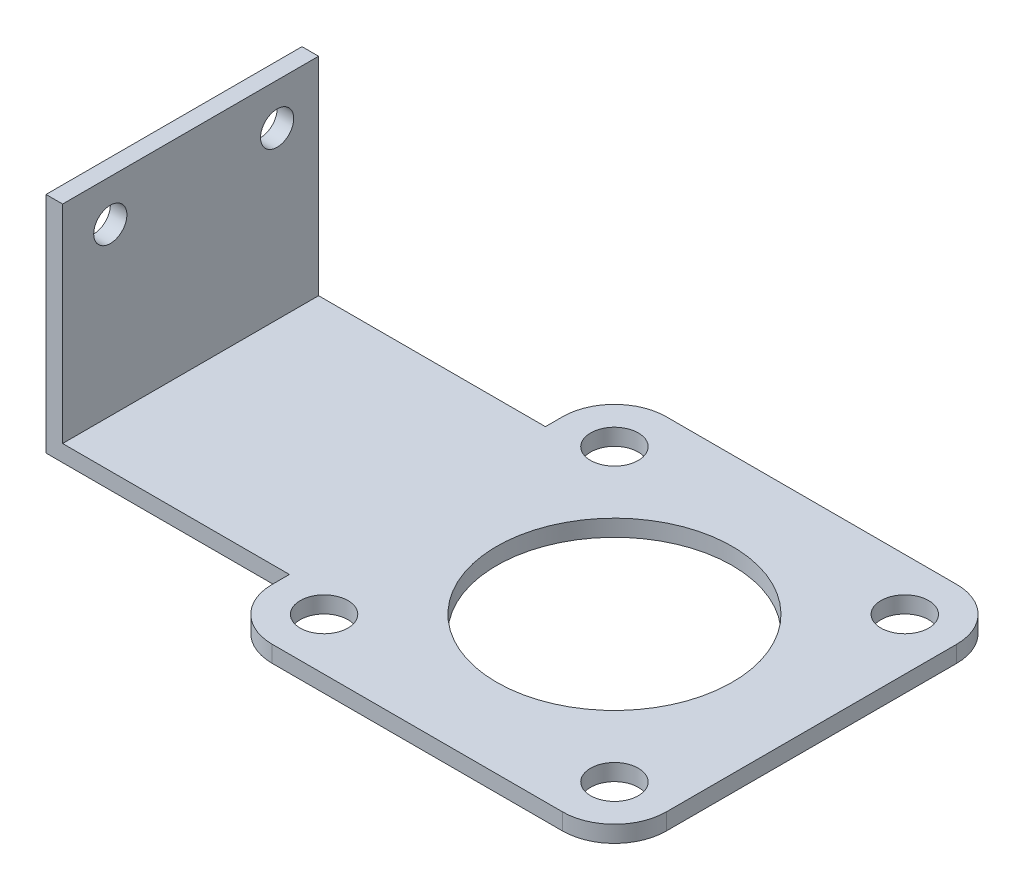
ISO-10303-21;
HEADER;
FILE_DESCRIPTION(('STEP AP214'),'2;1');
FILE_NAME('part.step','',(''),(''),'','','');
FILE_SCHEMA(('AUTOMOTIVE_DESIGN { 1 0 10303 214 1 1 1 1 }'));
ENDSEC;
DATA;
#1=APPLICATION_CONTEXT('core data for automotive mechanical design processes');
#2=APPLICATION_PROTOCOL_DEFINITION('international standard','automotive_design',2000,#1);
#3=PRODUCT_CONTEXT('',#1,'mechanical');
#4=PRODUCT('Part','Part','',(#3));
#5=PRODUCT_RELATED_PRODUCT_CATEGORY('part','',(#4));
#6=PRODUCT_DEFINITION_FORMATION('','',#4);
#7=PRODUCT_DEFINITION_CONTEXT('part definition',#1,'design');
#8=PRODUCT_DEFINITION('design','',#6,#7);
#9=PRODUCT_DEFINITION_SHAPE('','',#8);
#10=(LENGTH_UNIT() NAMED_UNIT(*) SI_UNIT(.MILLI.,.METRE.));
#11=(NAMED_UNIT(*) PLANE_ANGLE_UNIT() SI_UNIT($,.RADIAN.));
#12=(NAMED_UNIT(*) SI_UNIT($,.STERADIAN.) SOLID_ANGLE_UNIT());
#13=UNCERTAINTY_MEASURE_WITH_UNIT(LENGTH_MEASURE(1.E-05),#10,'distance_accuracy_value','');
#14=(GEOMETRIC_REPRESENTATION_CONTEXT(3) GLOBAL_UNCERTAINTY_ASSIGNED_CONTEXT((#13)) GLOBAL_UNIT_ASSIGNED_CONTEXT((#10,
#11,#12)) REPRESENTATION_CONTEXT('',''));
#15=CARTESIAN_POINT('',(0.,0.,0.));
#16=DIRECTION('',(0.,0.,1.));
#17=DIRECTION('',(1.,0.,0.));
#18=AXIS2_PLACEMENT_3D('',#15,#16,#17);
#19=CARTESIAN_POINT('',(82.5,4.,-82.5));
#20=DIRECTION('',(0.,-1.,0.));
#21=DIRECTION('',(0.,0.,-1.));
#22=AXIS2_PLACEMENT_3D('',#19,#20,#21);
#23=PLANE('',#22);
#24=CARTESIAN_POINT('',(47.5,4.,-47.5));
#25=DIRECTION('',(0.,1.,0.));
#26=DIRECTION('',(0.,0.,1.));
#27=AXIS2_PLACEMENT_3D('',#24,#25,#26);
#28=CIRCLE('',#27,28.395);
#29=CARTESIAN_POINT('',(47.5,4.,-19.105));
#30=VERTEX_POINT('',#29);
#31=EDGE_CURVE('E624',#30,#30,#28,.T.);
#32=ORIENTED_EDGE('',*,*,#31,.F.);
#33=EDGE_LOOP('',(#32));
#34=FACE_BOUND('',#33,.T.);
#35=CARTESIAN_POINT('',(12.5000000000001,4.,-82.5));
#36=DIRECTION('',(0.,-1.,0.));
#37=DIRECTION('',(0.,0.,-1.));
#38=AXIS2_PLACEMENT_3D('',#35,#36,#37);
#39=CIRCLE('',#38,5.75000000000001);
#40=CARTESIAN_POINT('',(12.5000000000001,4.,-88.25));
#41=VERTEX_POINT('',#40);
#42=EDGE_CURVE('E220',#41,#41,#39,.F.);
#43=ORIENTED_EDGE('',*,*,#42,.F.);
#44=EDGE_LOOP('',(#43));
#45=FACE_BOUND('',#44,.T.);
#46=CARTESIAN_POINT('',(82.5,4.,-12.5000000000001));
#47=DIRECTION('',(0.,-1.,0.));
#48=DIRECTION('',(0.,0.,-1.));
#49=AXIS2_PLACEMENT_3D('',#46,#47,#48);
#50=CIRCLE('',#49,5.75);
#51=CARTESIAN_POINT('',(82.5,4.,-18.2500000000001));
#52=VERTEX_POINT('',#51);
#53=EDGE_CURVE('E225',#52,#52,#50,.F.);
#54=ORIENTED_EDGE('',*,*,#53,.F.);
#55=EDGE_LOOP('',(#54));
#56=FACE_BOUND('',#55,.T.);
#57=CARTESIAN_POINT('',(12.5,4.,-12.5));
#58=DIRECTION('',(0.,-1.,0.));
#59=DIRECTION('',(0.,0.,-1.));
#60=AXIS2_PLACEMENT_3D('',#57,#58,#59);
#61=CIRCLE('',#60,5.75);
#62=CARTESIAN_POINT('',(12.5,4.,-18.25));
#63=VERTEX_POINT('',#62);
#64=EDGE_CURVE('E230',#63,#63,#61,.F.);
#65=ORIENTED_EDGE('',*,*,#64,.F.);
#66=EDGE_LOOP('',(#65));
#67=FACE_BOUND('',#66,.T.);
#68=CARTESIAN_POINT('',(82.5,4.,-82.5));
#69=DIRECTION('',(0.,-1.,0.));
#70=DIRECTION('',(0.,0.,-1.));
#71=AXIS2_PLACEMENT_3D('',#68,#69,#70);
#72=CIRCLE('',#71,5.75000000000003);
#73=CARTESIAN_POINT('',(82.5,4.,-88.25));
#74=VERTEX_POINT('',#73);
#75=EDGE_CURVE('E235',#74,#74,#72,.F.);
#76=ORIENTED_EDGE('',*,*,#75,.F.);
#77=EDGE_LOOP('',(#76));
#78=FACE_BOUND('',#77,.T.);
#79=DIRECTION('',(0.,0.,-1.));
#80=VECTOR('',#79,1.);
#81=CARTESIAN_POINT('',(-54.68,4.,-78.3587415155287));
#82=LINE('',#81,#80);
#83=CARTESIAN_POINT('',(-54.68,4.00000000000001,-16.6412584844545));
#84=VERTEX_POINT('',#83);
#85=CARTESIAN_POINT('',(-54.68,4.,-78.3587415155287));
#86=VERTEX_POINT('',#85);
#87=EDGE_CURVE('E65',#84,#86,#82,.T.);
#88=ORIENTED_EDGE('',*,*,#87,.F.);
#89=DIRECTION('',(1.,0.,0.));
#90=VECTOR('',#89,1.);
#91=CARTESIAN_POINT('',(-58.68,4.00000000000001,-16.6412584844545));
#92=LINE('',#91,#90);
#93=CARTESIAN_POINT('',(0.,4.,-16.6412584844545));
#94=VERTEX_POINT('',#93);
#95=EDGE_CURVE('E69',#84,#94,#92,.T.);
#96=ORIENTED_EDGE('',*,*,#95,.T.);
#97=DIRECTION('',(0.,0.,1.));
#98=VECTOR('',#97,1.);
#99=CARTESIAN_POINT('',(0.,4.,-12.5000000000001));
#100=LINE('',#99,#98);
#101=CARTESIAN_POINT('',(0.,4.,-12.5000000000001));
#102=VERTEX_POINT('',#101);
#103=EDGE_CURVE('E251',#94,#102,#100,.T.);
#104=ORIENTED_EDGE('',*,*,#103,.T.);
#105=CARTESIAN_POINT('',(12.5,4.,-12.5));
#106=DIRECTION('',(0.,1.,0.));
#107=DIRECTION('',(0.,0.,-1.));
#108=AXIS2_PLACEMENT_3D('',#105,#106,#107);
#109=CIRCLE('',#108,12.5);
#110=CARTESIAN_POINT('',(12.5000000000001,4.,0.));
#111=VERTEX_POINT('',#110);
#112=EDGE_CURVE('E256',#102,#111,#109,.T.);
#113=ORIENTED_EDGE('',*,*,#112,.T.);
#114=DIRECTION('',(1.,0.,0.));
#115=VECTOR('',#114,1.);
#116=CARTESIAN_POINT('',(12.5000000000001,4.,0.));
#117=LINE('',#116,#115);
#118=CARTESIAN_POINT('',(82.4999999999999,4.,0.));
#119=VERTEX_POINT('',#118);
#120=EDGE_CURVE('E259',#111,#119,#117,.T.);
#121=ORIENTED_EDGE('',*,*,#120,.T.);
#122=CARTESIAN_POINT('',(82.5,4.,-12.5));
#123=DIRECTION('',(0.,1.,0.));
#124=DIRECTION('',(0.,0.,-1.));
#125=AXIS2_PLACEMENT_3D('',#122,#123,#124);
#126=CIRCLE('',#125,12.5);
#127=CARTESIAN_POINT('',(95.,4.,-12.5000000000001));
#128=VERTEX_POINT('',#127);
#129=EDGE_CURVE('E262',#119,#128,#126,.T.);
#130=ORIENTED_EDGE('',*,*,#129,.T.);
#131=DIRECTION('',(0.,0.,-1.));
#132=VECTOR('',#131,1.);
#133=CARTESIAN_POINT('',(95.,4.,-82.4999999999999));
#134=LINE('',#133,#132);
#135=CARTESIAN_POINT('',(95.,4.,-82.4999999999999));
#136=VERTEX_POINT('',#135);
#137=EDGE_CURVE('E265',#128,#136,#134,.T.);
#138=ORIENTED_EDGE('',*,*,#137,.T.);
#139=CARTESIAN_POINT('',(82.5,4.,-82.5));
#140=DIRECTION('',(0.,1.,0.));
#141=DIRECTION('',(0.,0.,-1.));
#142=AXIS2_PLACEMENT_3D('',#139,#140,#141);
#143=CIRCLE('',#142,12.5);
#144=CARTESIAN_POINT('',(82.4999999999999,4.,-95.));
#145=VERTEX_POINT('',#144);
#146=EDGE_CURVE('E240',#136,#145,#143,.T.);
#147=ORIENTED_EDGE('',*,*,#146,.T.);
#148=DIRECTION('',(-1.,0.,0.));
#149=VECTOR('',#148,1.);
#150=CARTESIAN_POINT('',(12.5000000000001,4.,-95.));
#151=LINE('',#150,#149);
#152=CARTESIAN_POINT('',(12.5000000000001,4.,-95.));
#153=VERTEX_POINT('',#152);
#154=EDGE_CURVE('E244',#145,#153,#151,.T.);
#155=ORIENTED_EDGE('',*,*,#154,.T.);
#156=CARTESIAN_POINT('',(12.5,4.,-82.5));
#157=DIRECTION('',(0.,1.,0.));
#158=DIRECTION('',(0.,0.,1.));
#159=AXIS2_PLACEMENT_3D('',#156,#157,#158);
#160=CIRCLE('',#159,12.5);
#161=CARTESIAN_POINT('',(0.,4.,-82.4999999999999));
#162=VERTEX_POINT('',#161);
#163=EDGE_CURVE('E248',#153,#162,#160,.T.);
#164=ORIENTED_EDGE('',*,*,#163,.T.);
#165=CARTESIAN_POINT('',(0.,4.,-78.3587415155287));
#166=VERTEX_POINT('',#165);
#167=EDGE_CURVE('E252',#162,#166,#100,.T.);
#168=ORIENTED_EDGE('',*,*,#167,.T.);
#169=DIRECTION('',(1.,0.,0.));
#170=VECTOR('',#169,1.);
#171=CARTESIAN_POINT('',(-58.68,4.,-78.3587415155287));
#172=LINE('',#171,#170);
#173=EDGE_CURVE('E214',#86,#166,#172,.T.);
#174=ORIENTED_EDGE('',*,*,#173,.F.);
#175=EDGE_LOOP('',(#88,#96,#104,#113,#121,#130,#138,#147,#155,#164,#168,#174));
#176=FACE_BOUND('',#175,.T.);
#177=ADVANCED_FACE('F47',(#34,#45,#56,#67,#78,#176),#23,.F.);
#178=CARTESIAN_POINT('',(0.,4.,-12.5000000000001));
#179=DIRECTION('',(1.,0.,0.));
#180=DIRECTION('',(0.,0.,-1.));
#181=AXIS2_PLACEMENT_3D('',#178,#179,#180);
#182=PLANE('',#181);
#183=DIRECTION('',(0.,1.,0.));
#184=VECTOR('',#183,1.);
#185=CARTESIAN_POINT('',(0.,0.,-16.6412584844545));
#186=LINE('',#185,#184);
#187=CARTESIAN_POINT('',(0.,0.,-16.6412584844545));
#188=VERTEX_POINT('',#187);
#189=EDGE_CURVE('E196',#188,#94,#186,.T.);
#190=ORIENTED_EDGE('',*,*,#189,.F.);
#191=DIRECTION('',(0.,0.,1.));
#192=VECTOR('',#191,1.);
#193=CARTESIAN_POINT('',(0.,0.,-12.5000000000001));
#194=LINE('',#193,#192);
#195=CARTESIAN_POINT('',(0.,0.,-12.5000000000001));
#196=VERTEX_POINT('',#195);
#197=EDGE_CURVE('E278',#188,#196,#194,.T.);
#198=ORIENTED_EDGE('',*,*,#197,.T.);
#199=DIRECTION('',(0.,-1.,0.));
#200=VECTOR('',#199,1.);
#201=CARTESIAN_POINT('',(0.,4.,-12.5000000000001));
#202=LINE('',#201,#200);
#203=EDGE_CURVE('E308',#102,#196,#202,.T.);
#204=ORIENTED_EDGE('',*,*,#203,.F.);
#205=ORIENTED_EDGE('',*,*,#103,.F.);
#206=EDGE_LOOP('',(#190,#198,#204,#205));
#207=FACE_BOUND('',#206,.T.);
#208=ADVANCED_FACE('F358',(#207),#182,.F.);
#209=DIRECTION('',(0.,-1.,0.));
#210=VECTOR('',#209,1.);
#211=CARTESIAN_POINT('',(0.,4.,-78.3587415155287));
#212=LINE('',#211,#210);
#213=CARTESIAN_POINT('',(0.,0.,-78.3587415155287));
#214=VERTEX_POINT('',#213);
#215=EDGE_CURVE('E161',#166,#214,#212,.T.);
#216=ORIENTED_EDGE('',*,*,#215,.F.);
#217=ORIENTED_EDGE('',*,*,#167,.F.);
#218=DIRECTION('',(0.,-1.,0.));
#219=VECTOR('',#218,1.);
#220=CARTESIAN_POINT('',(0.,4.,-82.4999999999999));
#221=LINE('',#220,#219);
#222=CARTESIAN_POINT('',(0.,0.,-82.4999999999999));
#223=VERTEX_POINT('',#222);
#224=EDGE_CURVE('E312',#162,#223,#221,.T.);
#225=ORIENTED_EDGE('',*,*,#224,.T.);
#226=EDGE_CURVE('E279',#223,#214,#194,.T.);
#227=ORIENTED_EDGE('',*,*,#226,.T.);
#228=EDGE_LOOP('',(#216,#217,#225,#227));
#229=FACE_BOUND('',#228,.T.);
#230=ADVANCED_FACE('F365',(#229),#182,.F.);
#231=CARTESIAN_POINT('',(82.5,4.,-82.5));
#232=DIRECTION('',(0.,-1.,0.));
#233=DIRECTION('',(0.,0.,-1.));
#234=AXIS2_PLACEMENT_3D('',#231,#232,#233);
#235=CYLINDRICAL_SURFACE('',#234,12.5);
#236=CARTESIAN_POINT('',(82.5,0.,-82.5));
#237=DIRECTION('',(0.,1.,0.));
#238=DIRECTION('',(0.,0.,-1.));
#239=AXIS2_PLACEMENT_3D('',#236,#237,#238);
#240=CIRCLE('',#239,12.5);
#241=CARTESIAN_POINT('',(95.,0.,-82.4999999999999));
#242=VERTEX_POINT('',#241);
#243=CARTESIAN_POINT('',(82.4999999999999,0.,-95.));
#244=VERTEX_POINT('',#243);
#245=EDGE_CURVE('E239',#242,#244,#240,.T.);
#246=ORIENTED_EDGE('',*,*,#245,.T.);
#247=DIRECTION('',(0.,-1.,0.));
#248=VECTOR('',#247,1.);
#249=CARTESIAN_POINT('',(82.4999999999999,4.,-95.));
#250=LINE('',#249,#248);
#251=EDGE_CURVE('E11',#145,#244,#250,.T.);
#252=ORIENTED_EDGE('',*,*,#251,.F.);
#253=ORIENTED_EDGE('',*,*,#146,.F.);
#254=DIRECTION('',(0.,-1.,0.));
#255=VECTOR('',#254,1.);
#256=CARTESIAN_POINT('',(95.,4.,-82.4999999999999));
#257=LINE('',#256,#255);
#258=EDGE_CURVE('E268',#136,#242,#257,.T.);
#259=ORIENTED_EDGE('',*,*,#258,.T.);
#260=EDGE_LOOP('',(#246,#252,#253,#259));
#261=FACE_BOUND('',#260,.T.);
#262=ADVANCED_FACE('F49',(#261),#235,.T.);
#263=CARTESIAN_POINT('',(12.5000000000001,4.,-95.));
#264=DIRECTION('',(0.,0.,1.));
#265=DIRECTION('',(1.,0.,0.));
#266=AXIS2_PLACEMENT_3D('',#263,#264,#265);
#267=PLANE('',#266);
#268=DIRECTION('',(-1.,0.,0.));
#269=VECTOR('',#268,1.);
#270=CARTESIAN_POINT('',(12.5000000000001,0.,-95.));
#271=LINE('',#270,#269);
#272=CARTESIAN_POINT('',(12.5000000000001,0.,-95.));
#273=VERTEX_POINT('',#272);
#274=EDGE_CURVE('E272',#244,#273,#271,.T.);
#275=ORIENTED_EDGE('',*,*,#274,.T.);
#276=DIRECTION('',(0.,-1.,0.));
#277=VECTOR('',#276,1.);
#278=CARTESIAN_POINT('',(12.5000000000001,4.,-95.));
#279=LINE('',#278,#277);
#280=EDGE_CURVE('E57',#153,#273,#279,.T.);
#281=ORIENTED_EDGE('',*,*,#280,.F.);
#282=ORIENTED_EDGE('',*,*,#154,.F.);
#283=ORIENTED_EDGE('',*,*,#251,.T.);
#284=EDGE_LOOP('',(#275,#281,#282,#283));
#285=FACE_BOUND('',#284,.T.);
#286=ADVANCED_FACE('F395',(#285),#267,.F.);
#287=CARTESIAN_POINT('',(12.5,4.,-82.5));
#288=DIRECTION('',(0.,-1.,0.));
#289=DIRECTION('',(0.,0.,-1.));
#290=AXIS2_PLACEMENT_3D('',#287,#288,#289);
#291=CYLINDRICAL_SURFACE('',#290,12.5);
#292=CARTESIAN_POINT('',(12.5,0.,-82.5));
#293=DIRECTION('',(0.,1.,0.));
#294=DIRECTION('',(0.,0.,1.));
#295=AXIS2_PLACEMENT_3D('',#292,#293,#294);
#296=CIRCLE('',#295,12.5);
#297=EDGE_CURVE('E275',#273,#223,#296,.T.);
#298=ORIENTED_EDGE('',*,*,#297,.T.);
#299=ORIENTED_EDGE('',*,*,#224,.F.);
#300=ORIENTED_EDGE('',*,*,#163,.F.);
#301=ORIENTED_EDGE('',*,*,#280,.T.);
#302=EDGE_LOOP('',(#298,#299,#300,#301));
#303=FACE_BOUND('',#302,.T.);
#304=ADVANCED_FACE('F391',(#303),#291,.T.);
#305=CARTESIAN_POINT('',(12.5,4.,-12.5));
#306=DIRECTION('',(0.,-1.,0.));
#307=DIRECTION('',(0.,0.,-1.));
#308=AXIS2_PLACEMENT_3D('',#305,#306,#307);
#309=CYLINDRICAL_SURFACE('',#308,12.5);
#310=CARTESIAN_POINT('',(12.5,0.,-12.5));
#311=DIRECTION('',(0.,1.,0.));
#312=DIRECTION('',(0.,0.,-1.));
#313=AXIS2_PLACEMENT_3D('',#310,#311,#312);
#314=CIRCLE('',#313,12.5);
#315=CARTESIAN_POINT('',(12.5000000000001,0.,0.));
#316=VERTEX_POINT('',#315);
#317=EDGE_CURVE('E282',#196,#316,#314,.T.);
#318=ORIENTED_EDGE('',*,*,#317,.T.);
#319=DIRECTION('',(0.,-1.,0.));
#320=VECTOR('',#319,1.);
#321=CARTESIAN_POINT('',(12.5000000000001,4.,0.));
#322=LINE('',#321,#320);
#323=EDGE_CURVE('E304',#111,#316,#322,.T.);
#324=ORIENTED_EDGE('',*,*,#323,.F.);
#325=ORIENTED_EDGE('',*,*,#112,.F.);
#326=ORIENTED_EDGE('',*,*,#203,.T.);
#327=EDGE_LOOP('',(#318,#324,#325,#326));
#328=FACE_BOUND('',#327,.T.);
#329=ADVANCED_FACE('F388',(#328),#309,.T.);
#330=CARTESIAN_POINT('',(12.5000000000001,4.,0.));
#331=DIRECTION('',(0.,0.,-1.));
#332=DIRECTION('',(-1.,0.,0.));
#333=AXIS2_PLACEMENT_3D('',#330,#331,#332);
#334=PLANE('',#333);
#335=DIRECTION('',(1.,0.,0.));
#336=VECTOR('',#335,1.);
#337=CARTESIAN_POINT('',(12.5000000000001,0.,0.));
#338=LINE('',#337,#336);
#339=CARTESIAN_POINT('',(82.4999999999999,0.,0.));
#340=VERTEX_POINT('',#339);
#341=EDGE_CURVE('E285',#316,#340,#338,.T.);
#342=ORIENTED_EDGE('',*,*,#341,.T.);
#343=DIRECTION('',(0.,-1.,0.));
#344=VECTOR('',#343,1.);
#345=CARTESIAN_POINT('',(82.4999999999999,4.,0.));
#346=LINE('',#345,#344);
#347=EDGE_CURVE('E300',#119,#340,#346,.T.);
#348=ORIENTED_EDGE('',*,*,#347,.F.);
#349=ORIENTED_EDGE('',*,*,#120,.F.);
#350=ORIENTED_EDGE('',*,*,#323,.T.);
#351=EDGE_LOOP('',(#342,#348,#349,#350));
#352=FACE_BOUND('',#351,.T.);
#353=ADVANCED_FACE('F384',(#352),#334,.F.);
#354=CARTESIAN_POINT('',(82.5,4.,-12.5));
#355=DIRECTION('',(0.,-1.,0.));
#356=DIRECTION('',(0.,0.,-1.));
#357=AXIS2_PLACEMENT_3D('',#354,#355,#356);
#358=CYLINDRICAL_SURFACE('',#357,12.5);
#359=CARTESIAN_POINT('',(82.5,0.,-12.5));
#360=DIRECTION('',(0.,1.,0.));
#361=DIRECTION('',(0.,0.,-1.));
#362=AXIS2_PLACEMENT_3D('',#359,#360,#361);
#363=CIRCLE('',#362,12.5);
#364=CARTESIAN_POINT('',(95.,0.,-12.5000000000001));
#365=VERTEX_POINT('',#364);
#366=EDGE_CURVE('E288',#340,#365,#363,.T.);
#367=ORIENTED_EDGE('',*,*,#366,.T.);
#368=DIRECTION('',(0.,-1.,0.));
#369=VECTOR('',#368,1.);
#370=CARTESIAN_POINT('',(95.,4.,-12.5000000000001));
#371=LINE('',#370,#369);
#372=EDGE_CURVE('E296',#128,#365,#371,.T.);
#373=ORIENTED_EDGE('',*,*,#372,.F.);
#374=ORIENTED_EDGE('',*,*,#129,.F.);
#375=ORIENTED_EDGE('',*,*,#347,.T.);
#376=EDGE_LOOP('',(#367,#373,#374,#375));
#377=FACE_BOUND('',#376,.T.);
#378=ADVANCED_FACE('F380',(#377),#358,.T.);
#379=CARTESIAN_POINT('',(95.,4.,-82.4999999999999));
#380=DIRECTION('',(-1.,0.,0.));
#381=DIRECTION('',(0.,0.,1.));
#382=AXIS2_PLACEMENT_3D('',#379,#380,#381);
#383=PLANE('',#382);
#384=DIRECTION('',(0.,0.,-1.));
#385=VECTOR('',#384,1.);
#386=CARTESIAN_POINT('',(95.,0.,-82.4999999999999));
#387=LINE('',#386,#385);
#388=EDGE_CURVE('E245',#365,#242,#387,.T.);
#389=ORIENTED_EDGE('',*,*,#388,.T.);
#390=ORIENTED_EDGE('',*,*,#258,.F.);
#391=ORIENTED_EDGE('',*,*,#137,.F.);
#392=ORIENTED_EDGE('',*,*,#372,.T.);
#393=EDGE_LOOP('',(#389,#390,#391,#392));
#394=FACE_BOUND('',#393,.T.);
#395=ADVANCED_FACE('F376',(#394),#383,.F.);
#396=CARTESIAN_POINT('',(82.5,0.,-82.5));
#397=DIRECTION('',(0.,-1.,0.));
#398=DIRECTION('',(0.,0.,-1.));
#399=AXIS2_PLACEMENT_3D('',#396,#397,#398);
#400=PLANE('',#399);
#401=CARTESIAN_POINT('',(47.5,0.,-47.5));
#402=DIRECTION('',(0.,-1.,0.));
#403=DIRECTION('',(0.,0.,-1.));
#404=AXIS2_PLACEMENT_3D('',#401,#402,#403);
#405=CIRCLE('',#404,28.395);
#406=CARTESIAN_POINT('',(47.5,0.,-75.895));
#407=VERTEX_POINT('',#406);
#408=EDGE_CURVE('E51',#407,#407,#405,.T.);
#409=ORIENTED_EDGE('',*,*,#408,.F.);
#410=EDGE_LOOP('',(#409));
#411=FACE_BOUND('',#410,.T.);
#412=CARTESIAN_POINT('',(82.5,0.,-82.5));
#413=DIRECTION('',(0.,-1.,0.));
#414=DIRECTION('',(0.,0.,-1.));
#415=AXIS2_PLACEMENT_3D('',#412,#413,#414);
#416=CIRCLE('',#415,5.75000000000003);
#417=CARTESIAN_POINT('',(82.5,0.,-88.25));
#418=VERTEX_POINT('',#417);
#419=EDGE_CURVE('E234',#418,#418,#416,.F.);
#420=ORIENTED_EDGE('',*,*,#419,.T.);
#421=EDGE_LOOP('',(#420));
#422=FACE_BOUND('',#421,.T.);
#423=CARTESIAN_POINT('',(12.5,0.,-12.5));
#424=DIRECTION('',(0.,-1.,0.));
#425=DIRECTION('',(0.,0.,-1.));
#426=AXIS2_PLACEMENT_3D('',#423,#424,#425);
#427=CIRCLE('',#426,5.75);
#428=CARTESIAN_POINT('',(12.5,0.,-18.25));
#429=VERTEX_POINT('',#428);
#430=EDGE_CURVE('E229',#429,#429,#427,.F.);
#431=ORIENTED_EDGE('',*,*,#430,.T.);
#432=EDGE_LOOP('',(#431));
#433=FACE_BOUND('',#432,.T.);
#434=CARTESIAN_POINT('',(82.5,0.,-12.5000000000001));
#435=DIRECTION('',(0.,-1.,0.));
#436=DIRECTION('',(0.,0.,-1.));
#437=AXIS2_PLACEMENT_3D('',#434,#435,#436);
#438=CIRCLE('',#437,5.75);
#439=CARTESIAN_POINT('',(82.5,0.,-18.2500000000001));
#440=VERTEX_POINT('',#439);
#441=EDGE_CURVE('E224',#440,#440,#438,.F.);
#442=ORIENTED_EDGE('',*,*,#441,.T.);
#443=EDGE_LOOP('',(#442));
#444=FACE_BOUND('',#443,.T.);
#445=CARTESIAN_POINT('',(12.5000000000001,0.,-82.5));
#446=DIRECTION('',(0.,-1.,0.));
#447=DIRECTION('',(0.,0.,-1.));
#448=AXIS2_PLACEMENT_3D('',#445,#446,#447);
#449=CIRCLE('',#448,5.75000000000001);
#450=CARTESIAN_POINT('',(12.5000000000001,0.,-88.25));
#451=VERTEX_POINT('',#450);
#452=EDGE_CURVE('E219',#451,#451,#449,.F.);
#453=ORIENTED_EDGE('',*,*,#452,.T.);
#454=EDGE_LOOP('',(#453));
#455=FACE_BOUND('',#454,.T.);
#456=ORIENTED_EDGE('',*,*,#245,.F.);
#457=ORIENTED_EDGE('',*,*,#388,.F.);
#458=ORIENTED_EDGE('',*,*,#366,.F.);
#459=ORIENTED_EDGE('',*,*,#341,.F.);
#460=ORIENTED_EDGE('',*,*,#317,.F.);
#461=ORIENTED_EDGE('',*,*,#197,.F.);
#462=DIRECTION('',(1.,0.,0.));
#463=VECTOR('',#462,1.);
#464=CARTESIAN_POINT('',(-58.68,0.,-16.6412584844545));
#465=LINE('',#464,#463);
#466=CARTESIAN_POINT('',(-58.68,0.,-16.6412584844545));
#467=VERTEX_POINT('',#466);
#468=EDGE_CURVE('E202',#467,#188,#465,.T.);
#469=ORIENTED_EDGE('',*,*,#468,.F.);
#470=DIRECTION('',(0.,0.,1.));
#471=VECTOR('',#470,1.);
#472=CARTESIAN_POINT('',(-58.68,0.,-78.3587415155287));
#473=LINE('',#472,#471);
#474=CARTESIAN_POINT('',(-58.68,0.,-78.3587415155287));
#475=VERTEX_POINT('',#474);
#476=EDGE_CURVE('E155',#475,#467,#473,.T.);
#477=ORIENTED_EDGE('',*,*,#476,.F.);
#478=DIRECTION('',(1.,0.,0.));
#479=VECTOR('',#478,1.);
#480=CARTESIAN_POINT('',(-58.68,0.,-78.3587415155287));
#481=LINE('',#480,#479);
#482=EDGE_CURVE('E210',#475,#214,#481,.T.);
#483=ORIENTED_EDGE('',*,*,#482,.T.);
#484=ORIENTED_EDGE('',*,*,#226,.F.);
#485=ORIENTED_EDGE('',*,*,#297,.F.);
#486=ORIENTED_EDGE('',*,*,#274,.F.);
#487=EDGE_LOOP('',(#456,#457,#458,#459,#460,#461,#469,#477,#483,#484,#485,#486));
#488=FACE_BOUND('',#487,.T.);
#489=ADVANCED_FACE('F374',(#411,#422,#433,#444,#455,#488),#400,.T.);
#490=CARTESIAN_POINT('',(12.5000000000001,14.,-82.5));
#491=DIRECTION('',(0.,-1.,0.));
#492=DIRECTION('',(0.,0.,-1.));
#493=AXIS2_PLACEMENT_3D('',#490,#491,#492);
#494=CYLINDRICAL_SURFACE('',#493,5.75000000000001);
#495=ORIENTED_EDGE('',*,*,#452,.F.);
#496=EDGE_LOOP('',(#495));
#497=FACE_BOUND('',#496,.T.);
#498=ORIENTED_EDGE('',*,*,#42,.T.);
#499=EDGE_LOOP('',(#498));
#500=FACE_BOUND('',#499,.T.);
#501=ADVANCED_FACE('F372',(#497,#500),#494,.F.);
#502=CARTESIAN_POINT('',(82.5,14.,-12.5000000000001));
#503=DIRECTION('',(0.,-1.,0.));
#504=DIRECTION('',(0.,0.,-1.));
#505=AXIS2_PLACEMENT_3D('',#502,#503,#504);
#506=CYLINDRICAL_SURFACE('',#505,5.75);
#507=ORIENTED_EDGE('',*,*,#441,.F.);
#508=EDGE_LOOP('',(#507));
#509=FACE_BOUND('',#508,.T.);
#510=ORIENTED_EDGE('',*,*,#53,.T.);
#511=EDGE_LOOP('',(#510));
#512=FACE_BOUND('',#511,.T.);
#513=ADVANCED_FACE('F434',(#509,#512),#506,.F.);
#514=CARTESIAN_POINT('',(12.5,14.,-12.5));
#515=DIRECTION('',(0.,-1.,0.));
#516=DIRECTION('',(0.,0.,-1.));
#517=AXIS2_PLACEMENT_3D('',#514,#515,#516);
#518=CYLINDRICAL_SURFACE('',#517,5.75);
#519=ORIENTED_EDGE('',*,*,#430,.F.);
#520=EDGE_LOOP('',(#519));
#521=FACE_BOUND('',#520,.T.);
#522=ORIENTED_EDGE('',*,*,#64,.T.);
#523=EDGE_LOOP('',(#522));
#524=FACE_BOUND('',#523,.T.);
#525=ADVANCED_FACE('F437',(#521,#524),#518,.F.);
#526=CARTESIAN_POINT('',(82.5,14.,-82.5));
#527=DIRECTION('',(0.,-1.,0.));
#528=DIRECTION('',(0.,0.,-1.));
#529=AXIS2_PLACEMENT_3D('',#526,#527,#528);
#530=CYLINDRICAL_SURFACE('',#529,5.75000000000003);
#531=ORIENTED_EDGE('',*,*,#419,.F.);
#532=EDGE_LOOP('',(#531));
#533=FACE_BOUND('',#532,.T.);
#534=ORIENTED_EDGE('',*,*,#75,.T.);
#535=EDGE_LOOP('',(#534));
#536=FACE_BOUND('',#535,.T.);
#537=ADVANCED_FACE('F433',(#533,#536),#530,.F.);
#538=CARTESIAN_POINT('',(-58.68,0.,-16.6412584844545));
#539=DIRECTION('',(0.,0.,-1.));
#540=DIRECTION('',(0.,1.,0.));
#541=AXIS2_PLACEMENT_3D('',#538,#539,#540);
#542=PLANE('',#541);
#543=ORIENTED_EDGE('',*,*,#189,.T.);
#544=ORIENTED_EDGE('',*,*,#95,.F.);
#545=DIRECTION('',(0.,-1.,0.));
#546=VECTOR('',#545,1.);
#547=CARTESIAN_POINT('',(-54.68,54.,-16.6412584844545));
#548=LINE('',#547,#546);
#549=CARTESIAN_POINT('',(-54.68,54.,-16.6412584844545));
#550=VERTEX_POINT('',#549);
#551=EDGE_CURVE('E168',#550,#84,#548,.T.);
#552=ORIENTED_EDGE('',*,*,#551,.F.);
#553=DIRECTION('',(1.,0.,0.));
#554=VECTOR('',#553,1.);
#555=CARTESIAN_POINT('',(-54.68,54.,-16.6412584844545));
#556=LINE('',#555,#554);
#557=CARTESIAN_POINT('',(-58.68,54.,-16.6412584844545));
#558=VERTEX_POINT('',#557);
#559=EDGE_CURVE('E164',#558,#550,#556,.T.);
#560=ORIENTED_EDGE('',*,*,#559,.F.);
#561=DIRECTION('',(0.,1.,0.));
#562=VECTOR('',#561,1.);
#563=CARTESIAN_POINT('',(-58.68,0.,-16.6412584844545));
#564=LINE('',#563,#562);
#565=EDGE_CURVE('E149',#467,#558,#564,.T.);
#566=ORIENTED_EDGE('',*,*,#565,.F.);
#567=ORIENTED_EDGE('',*,*,#468,.T.);
#568=EDGE_LOOP('',(#543,#544,#552,#560,#566,#567));
#569=FACE_BOUND('',#568,.T.);
#570=ADVANCED_FACE('F166',(#569),#542,.F.);
#571=CARTESIAN_POINT('',(-58.68,4.,-78.3587415155287));
#572=DIRECTION('',(0.,0.,1.));
#573=DIRECTION('',(1.,0.,0.));
#574=AXIS2_PLACEMENT_3D('',#571,#572,#573);
#575=PLANE('',#574);
#576=ORIENTED_EDGE('',*,*,#215,.T.);
#577=ORIENTED_EDGE('',*,*,#482,.F.);
#578=DIRECTION('',(0.,-1.,0.));
#579=VECTOR('',#578,1.);
#580=CARTESIAN_POINT('',(-58.68,4.,-78.3587415155287));
#581=LINE('',#580,#579);
#582=CARTESIAN_POINT('',(-58.68,54.,-78.3587415155287));
#583=VERTEX_POINT('',#582);
#584=EDGE_CURVE('E160',#583,#475,#581,.T.);
#585=ORIENTED_EDGE('',*,*,#584,.F.);
#586=DIRECTION('',(-1.,0.,0.));
#587=VECTOR('',#586,1.);
#588=CARTESIAN_POINT('',(-58.68,54.,-78.3587415155287));
#589=LINE('',#588,#587);
#590=CARTESIAN_POINT('',(-54.68,54.,-78.3587415155287));
#591=VERTEX_POINT('',#590);
#592=EDGE_CURVE('E177',#591,#583,#589,.T.);
#593=ORIENTED_EDGE('',*,*,#592,.F.);
#594=DIRECTION('',(0.,-1.,0.));
#595=VECTOR('',#594,1.);
#596=CARTESIAN_POINT('',(-54.68,54.,-78.3587415155287));
#597=LINE('',#596,#595);
#598=EDGE_CURVE('E190',#591,#86,#597,.T.);
#599=ORIENTED_EDGE('',*,*,#598,.T.);
#600=ORIENTED_EDGE('',*,*,#173,.T.);
#601=EDGE_LOOP('',(#576,#577,#585,#593,#599,#600));
#602=FACE_BOUND('',#601,.T.);
#603=ADVANCED_FACE('F416',(#602),#575,.F.);
#604=CARTESIAN_POINT('',(-58.68,0.,0.));
#605=DIRECTION('',(1.,0.,0.));
#606=DIRECTION('',(0.,0.,-1.));
#607=AXIS2_PLACEMENT_3D('',#604,#605,#606);
#608=PLANE('',#607);
#609=CARTESIAN_POINT('',(-58.68,44.,-68.3587415155287));
#610=DIRECTION('',(-1.,0.,0.));
#611=DIRECTION('',(0.,0.,1.));
#612=AXIS2_PLACEMENT_3D('',#609,#610,#611);
#613=CIRCLE('',#612,4.00000000000001);
#614=CARTESIAN_POINT('',(-58.68,44.,-64.3587415155287));
#615=VERTEX_POINT('',#614);
#616=EDGE_CURVE('E334',#615,#615,#613,.T.);
#617=ORIENTED_EDGE('',*,*,#616,.F.);
#618=EDGE_LOOP('',(#617));
#619=FACE_BOUND('',#618,.T.);
#620=CARTESIAN_POINT('',(-58.68,44.,-28.1412584844545));
#621=DIRECTION('',(-1.,0.,0.));
#622=DIRECTION('',(0.,0.,1.));
#623=AXIS2_PLACEMENT_3D('',#620,#621,#622);
#624=CIRCLE('',#623,4.);
#625=CARTESIAN_POINT('',(-58.68,44.,-24.1412584844545));
#626=VERTEX_POINT('',#625);
#627=EDGE_CURVE('E184',#626,#626,#624,.T.);
#628=ORIENTED_EDGE('',*,*,#627,.F.);
#629=EDGE_LOOP('',(#628));
#630=FACE_BOUND('',#629,.T.);
#631=ORIENTED_EDGE('',*,*,#565,.T.);
#632=DIRECTION('',(0.,0.,1.));
#633=VECTOR('',#632,1.);
#634=CARTESIAN_POINT('',(-58.68,54.,-16.6412584844545));
#635=LINE('',#634,#633);
#636=EDGE_CURVE('E153',#583,#558,#635,.T.);
#637=ORIENTED_EDGE('',*,*,#636,.F.);
#638=ORIENTED_EDGE('',*,*,#584,.T.);
#639=ORIENTED_EDGE('',*,*,#476,.T.);
#640=EDGE_LOOP('',(#631,#637,#638,#639));
#641=FACE_BOUND('',#640,.T.);
#642=ADVANCED_FACE('F151',(#619,#630,#641),#608,.F.);
#643=CARTESIAN_POINT('',(-54.68,54.,-78.3587415155287));
#644=DIRECTION('',(-1.,0.,0.));
#645=DIRECTION('',(0.,0.,1.));
#646=AXIS2_PLACEMENT_3D('',#643,#644,#645);
#647=PLANE('',#646);
#648=CARTESIAN_POINT('',(-54.68,44.,-68.3587415155287));
#649=DIRECTION('',(-1.,0.,0.));
#650=DIRECTION('',(0.,0.,1.));
#651=AXIS2_PLACEMENT_3D('',#648,#649,#650);
#652=CIRCLE('',#651,4.00000000000001);
#653=CARTESIAN_POINT('',(-54.68,44.,-64.3587415155287));
#654=VERTEX_POINT('',#653);
#655=EDGE_CURVE('E181',#654,#654,#652,.T.);
#656=ORIENTED_EDGE('',*,*,#655,.T.);
#657=EDGE_LOOP('',(#656));
#658=FACE_BOUND('',#657,.T.);
#659=CARTESIAN_POINT('',(-54.68,44.,-28.1412584844545));
#660=DIRECTION('',(-1.,0.,0.));
#661=DIRECTION('',(0.,0.,1.));
#662=AXIS2_PLACEMENT_3D('',#659,#660,#661);
#663=CIRCLE('',#662,4.);
#664=CARTESIAN_POINT('',(-54.68,44.,-24.1412584844545));
#665=VERTEX_POINT('',#664);
#666=EDGE_CURVE('E331',#665,#665,#663,.T.);
#667=ORIENTED_EDGE('',*,*,#666,.T.);
#668=EDGE_LOOP('',(#667));
#669=FACE_BOUND('',#668,.T.);
#670=ORIENTED_EDGE('',*,*,#87,.T.);
#671=ORIENTED_EDGE('',*,*,#598,.F.);
#672=DIRECTION('',(0.,0.,-1.));
#673=VECTOR('',#672,1.);
#674=CARTESIAN_POINT('',(-54.68,54.,-78.3587415155287));
#675=LINE('',#674,#673);
#676=EDGE_CURVE('E172',#550,#591,#675,.T.);
#677=ORIENTED_EDGE('',*,*,#676,.F.);
#678=ORIENTED_EDGE('',*,*,#551,.T.);
#679=EDGE_LOOP('',(#670,#671,#677,#678));
#680=FACE_BOUND('',#679,.T.);
#681=ADVANCED_FACE('F339',(#658,#669,#680),#647,.F.);
#682=CARTESIAN_POINT('',(0.,54.,0.));
#683=DIRECTION('',(0.,-1.,0.));
#684=DIRECTION('',(0.,0.,-1.));
#685=AXIS2_PLACEMENT_3D('',#682,#683,#684);
#686=PLANE('',#685);
#687=ORIENTED_EDGE('',*,*,#636,.T.);
#688=ORIENTED_EDGE('',*,*,#559,.T.);
#689=ORIENTED_EDGE('',*,*,#676,.T.);
#690=ORIENTED_EDGE('',*,*,#592,.T.);
#691=EDGE_LOOP('',(#687,#688,#689,#690));
#692=FACE_BOUND('',#691,.T.);
#693=ADVANCED_FACE('F175',(#692),#686,.F.);
#694=CARTESIAN_POINT('',(-38.68,44.,-28.1412584844545));
#695=DIRECTION('',(-1.,0.,0.));
#696=DIRECTION('',(0.,0.,1.));
#697=AXIS2_PLACEMENT_3D('',#694,#695,#696);
#698=CYLINDRICAL_SURFACE('',#697,4.);
#699=ORIENTED_EDGE('',*,*,#627,.T.);
#700=EDGE_LOOP('',(#699));
#701=FACE_BOUND('',#700,.T.);
#702=ORIENTED_EDGE('',*,*,#666,.F.);
#703=EDGE_LOOP('',(#702));
#704=FACE_BOUND('',#703,.T.);
#705=ADVANCED_FACE('F345',(#701,#704),#698,.F.);
#706=CARTESIAN_POINT('',(-38.68,44.,-68.3587415155287));
#707=DIRECTION('',(-1.,0.,0.));
#708=DIRECTION('',(0.,0.,1.));
#709=AXIS2_PLACEMENT_3D('',#706,#707,#708);
#710=CYLINDRICAL_SURFACE('',#709,4.00000000000001);
#711=ORIENTED_EDGE('',*,*,#616,.T.);
#712=EDGE_LOOP('',(#711));
#713=FACE_BOUND('',#712,.T.);
#714=ORIENTED_EDGE('',*,*,#655,.F.);
#715=EDGE_LOOP('',(#714));
#716=FACE_BOUND('',#715,.T.);
#717=ADVANCED_FACE('F342',(#713,#716),#710,.F.);
#718=CARTESIAN_POINT('',(47.5,-6.,-47.5));
#719=DIRECTION('',(0.,1.,0.));
#720=DIRECTION('',(0.,0.,1.));
#721=AXIS2_PLACEMENT_3D('',#718,#719,#720);
#722=CYLINDRICAL_SURFACE('',#721,28.395);
#723=ORIENTED_EDGE('',*,*,#408,.T.);
#724=EDGE_LOOP('',(#723));
#725=FACE_BOUND('',#724,.T.);
#726=ORIENTED_EDGE('',*,*,#31,.T.);
#727=EDGE_LOOP('',(#726));
#728=FACE_BOUND('',#727,.T.);
#729=ADVANCED_FACE('F344',(#725,#728),#722,.F.);
#730=CLOSED_SHELL('',(#177,#208,#230,#262,#286,#304,#329,#353,#378,#395,#489,#501,#513,#525,
#537,#570,#603,#642,#681,#693,#705,#717,#729));
#731=MANIFOLD_SOLID_BREP('B2',#730);
#732=ADVANCED_BREP_SHAPE_REPRESENTATION('',(#18,#731),#14);
#733=SHAPE_DEFINITION_REPRESENTATION(#9,#732);
ENDSEC;
END-ISO-10303-21;
